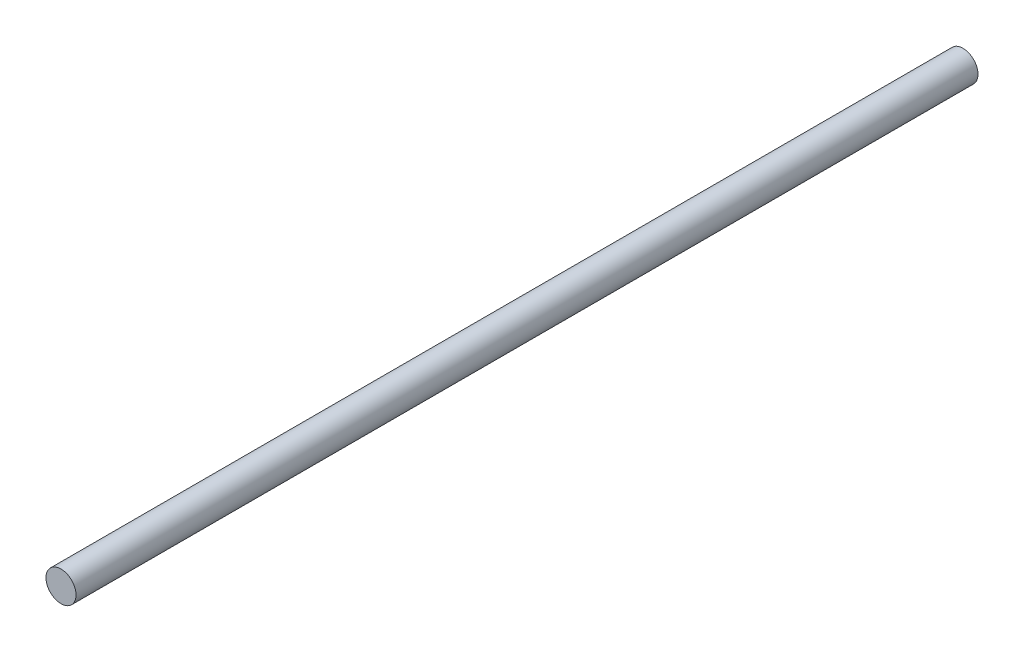
ISO-10303-21;
HEADER;
FILE_DESCRIPTION(('STEP AP214'),'2;1');
FILE_NAME('part.step','',(''),(''),'','','');
FILE_SCHEMA(('AUTOMOTIVE_DESIGN { 1 0 10303 214 1 1 1 1 }'));
ENDSEC;
DATA;
#1=APPLICATION_CONTEXT('core data for automotive mechanical design processes');
#2=APPLICATION_PROTOCOL_DEFINITION('international standard','automotive_design',2000,#1);
#3=PRODUCT_CONTEXT('',#1,'mechanical');
#4=PRODUCT('Part','Part','',(#3));
#5=PRODUCT_RELATED_PRODUCT_CATEGORY('part','',(#4));
#6=PRODUCT_DEFINITION_FORMATION('','',#4);
#7=PRODUCT_DEFINITION_CONTEXT('part definition',#1,'design');
#8=PRODUCT_DEFINITION('design','',#6,#7);
#9=PRODUCT_DEFINITION_SHAPE('','',#8);
#10=(LENGTH_UNIT() NAMED_UNIT(*) SI_UNIT(.MILLI.,.METRE.));
#11=(NAMED_UNIT(*) PLANE_ANGLE_UNIT() SI_UNIT($,.RADIAN.));
#12=(NAMED_UNIT(*) SI_UNIT($,.STERADIAN.) SOLID_ANGLE_UNIT());
#13=UNCERTAINTY_MEASURE_WITH_UNIT(LENGTH_MEASURE(1.E-05),#10,'distance_accuracy_value','');
#14=(GEOMETRIC_REPRESENTATION_CONTEXT(3) GLOBAL_UNCERTAINTY_ASSIGNED_CONTEXT((#13)) GLOBAL_UNIT_ASSIGNED_CONTEXT((#10,
#11,#12)) REPRESENTATION_CONTEXT('',''));
#15=CARTESIAN_POINT('',(0.,0.,0.));
#16=DIRECTION('',(0.,0.,1.));
#17=DIRECTION('',(1.,0.,0.));
#18=AXIS2_PLACEMENT_3D('',#15,#16,#17);
#19=CARTESIAN_POINT('',(0.,0.,750.));
#20=DIRECTION('',(0.,0.,-1.));
#21=DIRECTION('',(-1.,0.,0.));
#22=AXIS2_PLACEMENT_3D('',#19,#20,#21);
#23=CYLINDRICAL_SURFACE('',#22,12.5);
#24=CARTESIAN_POINT('',(0.,0.,750.));
#25=DIRECTION('',(0.,0.,1.));
#26=DIRECTION('',(1.,0.,0.));
#27=AXIS2_PLACEMENT_3D('',#24,#25,#26);
#28=CIRCLE('',#27,12.5);
#29=CARTESIAN_POINT('',(12.5,0.,750.));
#30=VERTEX_POINT('',#29);
#31=EDGE_CURVE('E10',#30,#30,#28,.T.);
#32=ORIENTED_EDGE('',*,*,#31,.F.);
#33=EDGE_LOOP('',(#32));
#34=FACE_BOUND('',#33,.T.);
#35=CARTESIAN_POINT('',(0.,0.,0.));
#36=DIRECTION('',(0.,0.,1.));
#37=DIRECTION('',(1.,0.,0.));
#38=AXIS2_PLACEMENT_3D('',#35,#36,#37);
#39=CIRCLE('',#38,12.5);
#40=CARTESIAN_POINT('',(12.5,0.,0.));
#41=VERTEX_POINT('',#40);
#42=EDGE_CURVE('E34',#41,#41,#39,.T.);
#43=ORIENTED_EDGE('',*,*,#42,.T.);
#44=EDGE_LOOP('',(#43));
#45=FACE_BOUND('',#44,.T.);
#46=ADVANCED_FACE('F31',(#34,#45),#23,.T.);
#47=CARTESIAN_POINT('',(0.,0.,750.));
#48=DIRECTION('',(0.,0.,1.));
#49=DIRECTION('',(1.,0.,0.));
#50=AXIS2_PLACEMENT_3D('',#47,#48,#49);
#51=PLANE('',#50);
#52=ORIENTED_EDGE('',*,*,#31,.T.);
#53=EDGE_LOOP('',(#52));
#54=FACE_BOUND('',#53,.T.);
#55=ADVANCED_FACE('F46',(#54),#51,.T.);
#56=CARTESIAN_POINT('',(0.,0.,0.));
#57=DIRECTION('',(0.,0.,1.));
#58=DIRECTION('',(1.,0.,0.));
#59=AXIS2_PLACEMENT_3D('',#56,#57,#58);
#60=PLANE('',#59);
#61=ORIENTED_EDGE('',*,*,#42,.F.);
#62=EDGE_LOOP('',(#61));
#63=FACE_BOUND('',#62,.T.);
#64=ADVANCED_FACE('F44',(#63),#60,.F.);
#65=CLOSED_SHELL('',(#46,#55,#64));
#66=MANIFOLD_SOLID_BREP('B2',#65);
#67=ADVANCED_BREP_SHAPE_REPRESENTATION('',(#18,#66),#14);
#68=SHAPE_DEFINITION_REPRESENTATION(#9,#67);
ENDSEC;
END-ISO-10303-21;
